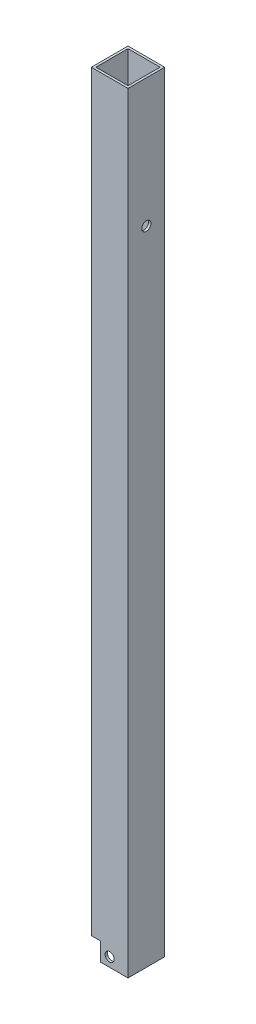
ISO-10303-21;
HEADER;
FILE_DESCRIPTION(('STEP AP214'),'2;1');
FILE_NAME('part.step','',(''),(''),'','','');
FILE_SCHEMA(('AUTOMOTIVE_DESIGN { 1 0 10303 214 1 1 1 1 }'));
ENDSEC;
DATA;
#1=APPLICATION_CONTEXT('core data for automotive mechanical design processes');
#2=APPLICATION_PROTOCOL_DEFINITION('international standard','automotive_design',2000,#1);
#3=PRODUCT_CONTEXT('',#1,'mechanical');
#4=PRODUCT('Part','Part','',(#3));
#5=PRODUCT_RELATED_PRODUCT_CATEGORY('part','',(#4));
#6=PRODUCT_DEFINITION_FORMATION('','',#4);
#7=PRODUCT_DEFINITION_CONTEXT('part definition',#1,'design');
#8=PRODUCT_DEFINITION('design','',#6,#7);
#9=PRODUCT_DEFINITION_SHAPE('','',#8);
#10=(LENGTH_UNIT() NAMED_UNIT(*) SI_UNIT(.MILLI.,.METRE.));
#11=(NAMED_UNIT(*) PLANE_ANGLE_UNIT() SI_UNIT($,.RADIAN.));
#12=(NAMED_UNIT(*) SI_UNIT($,.STERADIAN.) SOLID_ANGLE_UNIT());
#13=UNCERTAINTY_MEASURE_WITH_UNIT(LENGTH_MEASURE(1.E-05),#10,'distance_accuracy_value','');
#14=(GEOMETRIC_REPRESENTATION_CONTEXT(3) GLOBAL_UNCERTAINTY_ASSIGNED_CONTEXT((#13)) GLOBAL_UNIT_ASSIGNED_CONTEXT((#10,
#11,#12)) REPRESENTATION_CONTEXT('',''));
#15=CARTESIAN_POINT('',(0.,0.,0.));
#16=DIRECTION('',(0.,0.,1.));
#17=DIRECTION('',(1.,0.,0.));
#18=AXIS2_PLACEMENT_3D('',#15,#16,#17);
#19=CARTESIAN_POINT('',(0.,533.4,0.));
#20=DIRECTION('',(0.,-1.,0.));
#21=DIRECTION('',(0.,0.,-1.));
#22=AXIS2_PLACEMENT_3D('',#19,#20,#21);
#23=PLANE('',#22);
#24=DIRECTION('',(0.,0.,-1.));
#25=VECTOR('',#24,1.);
#26=CARTESIAN_POINT('',(12.7,533.4,12.7));
#27=LINE('',#26,#25);
#28=CARTESIAN_POINT('',(12.7,533.4,12.7));
#29=VERTEX_POINT('',#28);
#30=CARTESIAN_POINT('',(12.7,533.4,-12.7));
#31=VERTEX_POINT('',#30);
#32=EDGE_CURVE('E191',#29,#31,#27,.T.);
#33=ORIENTED_EDGE('',*,*,#32,.T.);
#34=DIRECTION('',(-1.,0.,0.));
#35=VECTOR('',#34,1.);
#36=CARTESIAN_POINT('',(-12.7,533.4,-12.7));
#37=LINE('',#36,#35);
#38=CARTESIAN_POINT('',(-12.7,533.4,-12.7));
#39=VERTEX_POINT('',#38);
#40=EDGE_CURVE('E194',#31,#39,#37,.T.);
#41=ORIENTED_EDGE('',*,*,#40,.T.);
#42=DIRECTION('',(0.,0.,1.));
#43=VECTOR('',#42,1.);
#44=CARTESIAN_POINT('',(-12.7,533.4,12.7));
#45=LINE('',#44,#43);
#46=CARTESIAN_POINT('',(-12.7,533.4,12.7));
#47=VERTEX_POINT('',#46);
#48=EDGE_CURVE('E197',#39,#47,#45,.T.);
#49=ORIENTED_EDGE('',*,*,#48,.T.);
#50=DIRECTION('',(1.,0.,0.));
#51=VECTOR('',#50,1.);
#52=CARTESIAN_POINT('',(-12.7,533.4,12.7));
#53=LINE('',#52,#51);
#54=EDGE_CURVE('E199',#47,#29,#53,.T.);
#55=ORIENTED_EDGE('',*,*,#54,.T.);
#56=EDGE_LOOP('',(#33,#41,#49,#55));
#57=FACE_BOUND('',#56,.T.);
#58=DIRECTION('',(0.,0.,-1.));
#59=VECTOR('',#58,1.);
#60=CARTESIAN_POINT('',(11.1125,533.4,11.1125));
#61=LINE('',#60,#59);
#62=CARTESIAN_POINT('',(11.1125,533.4,11.1125));
#63=VERTEX_POINT('',#62);
#64=CARTESIAN_POINT('',(11.1125,533.4,-11.1125));
#65=VERTEX_POINT('',#64);
#66=EDGE_CURVE('E165',#63,#65,#61,.T.);
#67=ORIENTED_EDGE('',*,*,#66,.F.);
#68=DIRECTION('',(1.,0.,0.));
#69=VECTOR('',#68,1.);
#70=CARTESIAN_POINT('',(-11.1125,533.4,11.1125));
#71=LINE('',#70,#69);
#72=CARTESIAN_POINT('',(-11.1125,533.4,11.1125));
#73=VERTEX_POINT('',#72);
#74=EDGE_CURVE('E172',#73,#63,#71,.T.);
#75=ORIENTED_EDGE('',*,*,#74,.F.);
#76=DIRECTION('',(0.,0.,1.));
#77=VECTOR('',#76,1.);
#78=CARTESIAN_POINT('',(-11.1125,533.4,11.1125));
#79=LINE('',#78,#77);
#80=CARTESIAN_POINT('',(-11.1125,533.4,-11.1125));
#81=VERTEX_POINT('',#80);
#82=EDGE_CURVE('E170',#81,#73,#79,.T.);
#83=ORIENTED_EDGE('',*,*,#82,.F.);
#84=DIRECTION('',(-1.,0.,0.));
#85=VECTOR('',#84,1.);
#86=CARTESIAN_POINT('',(-11.1125,533.4,-11.1125));
#87=LINE('',#86,#85);
#88=EDGE_CURVE('E167',#65,#81,#87,.T.);
#89=ORIENTED_EDGE('',*,*,#88,.F.);
#90=EDGE_LOOP('',(#67,#75,#83,#89));
#91=FACE_BOUND('',#90,.T.);
#92=ADVANCED_FACE('F33',(#57,#91),#23,.F.);
#93=CARTESIAN_POINT('',(0.,0.,0.));
#94=DIRECTION('',(0.,-1.,0.));
#95=DIRECTION('',(0.,0.,-1.));
#96=AXIS2_PLACEMENT_3D('',#93,#94,#95);
#97=PLANE('',#96);
#98=DIRECTION('',(0.,0.,1.));
#99=VECTOR('',#98,1.);
#100=CARTESIAN_POINT('',(-6.35,0.,-12.7));
#101=LINE('',#100,#99);
#102=CARTESIAN_POINT('',(-6.35,0.,-12.7));
#103=VERTEX_POINT('',#102);
#104=CARTESIAN_POINT('',(-6.35,0.,-11.1125));
#105=VERTEX_POINT('',#104);
#106=EDGE_CURVE('E156',#103,#105,#101,.T.);
#107=ORIENTED_EDGE('',*,*,#106,.F.);
#108=DIRECTION('',(-1.,0.,0.));
#109=VECTOR('',#108,1.);
#110=CARTESIAN_POINT('',(-12.7,0.,-12.7));
#111=LINE('',#110,#109);
#112=CARTESIAN_POINT('',(12.7,0.,-12.7));
#113=VERTEX_POINT('',#112);
#114=EDGE_CURVE('E145',#113,#103,#111,.T.);
#115=ORIENTED_EDGE('',*,*,#114,.F.);
#116=DIRECTION('',(0.,0.,-1.));
#117=VECTOR('',#116,1.);
#118=CARTESIAN_POINT('',(12.7,0.,12.7));
#119=LINE('',#118,#117);
#120=CARTESIAN_POINT('',(12.7,0.,12.7));
#121=VERTEX_POINT('',#120);
#122=EDGE_CURVE('E190',#121,#113,#119,.T.);
#123=ORIENTED_EDGE('',*,*,#122,.F.);
#124=DIRECTION('',(1.,0.,0.));
#125=VECTOR('',#124,1.);
#126=CARTESIAN_POINT('',(-12.7,0.,12.7));
#127=LINE('',#126,#125);
#128=CARTESIAN_POINT('',(-6.35,0.,12.7));
#129=VERTEX_POINT('',#128);
#130=EDGE_CURVE('E195',#129,#121,#127,.T.);
#131=ORIENTED_EDGE('',*,*,#130,.F.);
#132=CARTESIAN_POINT('',(-6.35,0.,11.1125));
#133=VERTEX_POINT('',#132);
#134=EDGE_CURVE('E158',#133,#129,#101,.T.);
#135=ORIENTED_EDGE('',*,*,#134,.F.);
#136=DIRECTION('',(1.,0.,0.));
#137=VECTOR('',#136,1.);
#138=CARTESIAN_POINT('',(-11.1125,0.,11.1125));
#139=LINE('',#138,#137);
#140=CARTESIAN_POINT('',(11.1125,0.,11.1125));
#141=VERTEX_POINT('',#140);
#142=EDGE_CURVE('E168',#133,#141,#139,.T.);
#143=ORIENTED_EDGE('',*,*,#142,.T.);
#144=DIRECTION('',(0.,0.,-1.));
#145=VECTOR('',#144,1.);
#146=CARTESIAN_POINT('',(11.1125,0.,11.1125));
#147=LINE('',#146,#145);
#148=CARTESIAN_POINT('',(11.1125,0.,-11.1125));
#149=VERTEX_POINT('',#148);
#150=EDGE_CURVE('E164',#141,#149,#147,.T.);
#151=ORIENTED_EDGE('',*,*,#150,.T.);
#152=DIRECTION('',(-1.,0.,0.));
#153=VECTOR('',#152,1.);
#154=CARTESIAN_POINT('',(-11.1125,0.,-11.1125));
#155=LINE('',#154,#153);
#156=EDGE_CURVE('E177',#149,#105,#155,.T.);
#157=ORIENTED_EDGE('',*,*,#156,.T.);
#158=EDGE_LOOP('',(#107,#115,#123,#131,#135,#143,#151,#157));
#159=FACE_BOUND('',#158,.T.);
#160=ADVANCED_FACE('F265',(#159),#97,.T.);
#161=CARTESIAN_POINT('',(12.7,533.4,12.7));
#162=DIRECTION('',(-1.,0.,0.));
#163=DIRECTION('',(0.,0.,1.));
#164=AXIS2_PLACEMENT_3D('',#161,#162,#163);
#165=PLANE('',#164);
#166=CARTESIAN_POINT('',(12.7,444.5,0.));
#167=DIRECTION('',(1.,0.,0.));
#168=DIRECTION('',(0.,0.,-1.));
#169=AXIS2_PLACEMENT_3D('',#166,#167,#168);
#170=CIRCLE('',#169,3.17499999999999);
#171=CARTESIAN_POINT('',(12.7,444.5,-3.17499999999999));
#172=VERTEX_POINT('',#171);
#173=EDGE_CURVE('E231',#172,#172,#170,.T.);
#174=ORIENTED_EDGE('',*,*,#173,.F.);
#175=EDGE_LOOP('',(#174));
#176=FACE_BOUND('',#175,.T.);
#177=ORIENTED_EDGE('',*,*,#122,.T.);
#178=DIRECTION('',(0.,-1.,0.));
#179=VECTOR('',#178,1.);
#180=CARTESIAN_POINT('',(12.7,533.4,-12.7));
#181=LINE('',#180,#179);
#182=EDGE_CURVE('E213',#31,#113,#181,.T.);
#183=ORIENTED_EDGE('',*,*,#182,.F.);
#184=ORIENTED_EDGE('',*,*,#32,.F.);
#185=DIRECTION('',(0.,-1.,0.));
#186=VECTOR('',#185,1.);
#187=CARTESIAN_POINT('',(12.7,533.4,12.7));
#188=LINE('',#187,#186);
#189=EDGE_CURVE('E201',#29,#121,#188,.T.);
#190=ORIENTED_EDGE('',*,*,#189,.T.);
#191=EDGE_LOOP('',(#177,#183,#184,#190));
#192=FACE_BOUND('',#191,.T.);
#193=ADVANCED_FACE('F35',(#176,#192),#165,.F.);
#194=CARTESIAN_POINT('',(-12.7,533.4,-12.7));
#195=DIRECTION('',(0.,0.,1.));
#196=DIRECTION('',(1.,0.,0.));
#197=AXIS2_PLACEMENT_3D('',#194,#195,#196);
#198=PLANE('',#197);
#199=CARTESIAN_POINT('',(0.,6.34999999999999,-12.7));
#200=DIRECTION('',(0.,0.,1.));
#201=DIRECTION('',(1.,0.,0.));
#202=AXIS2_PLACEMENT_3D('',#199,#200,#201);
#203=CIRCLE('',#202,3.175);
#204=CARTESIAN_POINT('',(3.175,6.34999999999999,-12.7));
#205=VERTEX_POINT('',#204);
#206=EDGE_CURVE('E217',#205,#205,#203,.T.);
#207=ORIENTED_EDGE('',*,*,#206,.T.);
#208=EDGE_LOOP('',(#207));
#209=FACE_BOUND('',#208,.T.);
#210=ORIENTED_EDGE('',*,*,#114,.T.);
#211=DIRECTION('',(0.,1.,0.));
#212=VECTOR('',#211,1.);
#213=CARTESIAN_POINT('',(-6.35,0.,-12.7));
#214=LINE('',#213,#212);
#215=CARTESIAN_POINT('',(-6.35,12.7,-12.7));
#216=VERTEX_POINT('',#215);
#217=EDGE_CURVE('E126',#103,#216,#214,.T.);
#218=ORIENTED_EDGE('',*,*,#217,.T.);
#219=DIRECTION('',(-1.,0.,0.));
#220=VECTOR('',#219,1.);
#221=CARTESIAN_POINT('',(-6.35,12.7,-12.7));
#222=LINE('',#221,#220);
#223=CARTESIAN_POINT('',(-12.7,12.7,-12.7));
#224=VERTEX_POINT('',#223);
#225=EDGE_CURVE('E135',#216,#224,#222,.T.);
#226=ORIENTED_EDGE('',*,*,#225,.T.);
#227=DIRECTION('',(0.,-1.,0.));
#228=VECTOR('',#227,1.);
#229=CARTESIAN_POINT('',(-12.7,533.4,-12.7));
#230=LINE('',#229,#228);
#231=EDGE_CURVE('E211',#39,#224,#230,.T.);
#232=ORIENTED_EDGE('',*,*,#231,.F.);
#233=ORIENTED_EDGE('',*,*,#40,.F.);
#234=ORIENTED_EDGE('',*,*,#182,.T.);
#235=EDGE_LOOP('',(#210,#218,#226,#232,#233,#234));
#236=FACE_BOUND('',#235,.T.);
#237=ADVANCED_FACE('F143',(#209,#236),#198,.F.);
#238=CARTESIAN_POINT('',(-12.7,533.4,12.7));
#239=DIRECTION('',(1.,0.,0.));
#240=DIRECTION('',(0.,0.,-1.));
#241=AXIS2_PLACEMENT_3D('',#238,#239,#240);
#242=PLANE('',#241);
#243=CARTESIAN_POINT('',(-12.7,444.5,0.));
#244=DIRECTION('',(1.,0.,0.));
#245=DIRECTION('',(0.,0.,-1.));
#246=AXIS2_PLACEMENT_3D('',#243,#244,#245);
#247=CIRCLE('',#246,3.17499999999999);
#248=CARTESIAN_POINT('',(-12.7,444.5,-3.17499999999999));
#249=VERTEX_POINT('',#248);
#250=EDGE_CURVE('E234',#249,#249,#247,.T.);
#251=ORIENTED_EDGE('',*,*,#250,.T.);
#252=EDGE_LOOP('',(#251));
#253=FACE_BOUND('',#252,.T.);
#254=ORIENTED_EDGE('',*,*,#231,.T.);
#255=DIRECTION('',(0.,0.,1.));
#256=VECTOR('',#255,1.);
#257=CARTESIAN_POINT('',(-12.7,12.7,-12.7));
#258=LINE('',#257,#256);
#259=CARTESIAN_POINT('',(-12.7,12.7,12.7));
#260=VERTEX_POINT('',#259);
#261=EDGE_CURVE('E131',#224,#260,#258,.T.);
#262=ORIENTED_EDGE('',*,*,#261,.T.);
#263=DIRECTION('',(0.,-1.,0.));
#264=VECTOR('',#263,1.);
#265=CARTESIAN_POINT('',(-12.7,533.4,12.7));
#266=LINE('',#265,#264);
#267=EDGE_CURVE('E208',#47,#260,#266,.T.);
#268=ORIENTED_EDGE('',*,*,#267,.F.);
#269=ORIENTED_EDGE('',*,*,#48,.F.);
#270=EDGE_LOOP('',(#254,#262,#268,#269));
#271=FACE_BOUND('',#270,.T.);
#272=ADVANCED_FACE('F276',(#253,#271),#242,.F.);
#273=CARTESIAN_POINT('',(-12.7,533.4,12.7));
#274=DIRECTION('',(0.,0.,-1.));
#275=DIRECTION('',(-1.,0.,0.));
#276=AXIS2_PLACEMENT_3D('',#273,#274,#275);
#277=PLANE('',#276);
#278=CARTESIAN_POINT('',(0.,6.34999999999999,12.7));
#279=DIRECTION('',(0.,0.,1.));
#280=DIRECTION('',(1.,0.,0.));
#281=AXIS2_PLACEMENT_3D('',#278,#279,#280);
#282=CIRCLE('',#281,3.175);
#283=CARTESIAN_POINT('',(3.175,6.34999999999999,12.7));
#284=VERTEX_POINT('',#283);
#285=EDGE_CURVE('E222',#284,#284,#282,.T.);
#286=ORIENTED_EDGE('',*,*,#285,.F.);
#287=EDGE_LOOP('',(#286));
#288=FACE_BOUND('',#287,.T.);
#289=DIRECTION('',(-1.,0.,0.));
#290=VECTOR('',#289,1.);
#291=CARTESIAN_POINT('',(-6.35,12.7,12.7));
#292=LINE('',#291,#290);
#293=CARTESIAN_POINT('',(-6.35,12.7,12.7));
#294=VERTEX_POINT('',#293);
#295=EDGE_CURVE('E146',#294,#260,#292,.T.);
#296=ORIENTED_EDGE('',*,*,#295,.F.);
#297=DIRECTION('',(0.,1.,0.));
#298=VECTOR('',#297,1.);
#299=CARTESIAN_POINT('',(-6.35,0.,12.7));
#300=LINE('',#299,#298);
#301=EDGE_CURVE('E148',#129,#294,#300,.T.);
#302=ORIENTED_EDGE('',*,*,#301,.F.);
#303=ORIENTED_EDGE('',*,*,#130,.T.);
#304=ORIENTED_EDGE('',*,*,#189,.F.);
#305=ORIENTED_EDGE('',*,*,#54,.F.);
#306=ORIENTED_EDGE('',*,*,#267,.T.);
#307=EDGE_LOOP('',(#296,#302,#303,#304,#305,#306));
#308=FACE_BOUND('',#307,.T.);
#309=ADVANCED_FACE('F279',(#288,#308),#277,.F.);
#310=CARTESIAN_POINT('',(11.1125,533.4,11.1125));
#311=DIRECTION('',(-1.,0.,0.));
#312=DIRECTION('',(0.,0.,1.));
#313=AXIS2_PLACEMENT_3D('',#310,#311,#312);
#314=PLANE('',#313);
#315=CARTESIAN_POINT('',(11.1125,444.5,0.));
#316=DIRECTION('',(-1.,0.,0.));
#317=DIRECTION('',(0.,0.,1.));
#318=AXIS2_PLACEMENT_3D('',#315,#316,#317);
#319=CIRCLE('',#318,3.17499999999999);
#320=CARTESIAN_POINT('',(11.1125,444.5,3.17499999999999));
#321=VERTEX_POINT('',#320);
#322=EDGE_CURVE('E227',#321,#321,#319,.T.);
#323=ORIENTED_EDGE('',*,*,#322,.F.);
#324=EDGE_LOOP('',(#323));
#325=FACE_BOUND('',#324,.T.);
#326=ORIENTED_EDGE('',*,*,#150,.F.);
#327=DIRECTION('',(0.,-1.,0.));
#328=VECTOR('',#327,1.);
#329=CARTESIAN_POINT('',(11.1125,533.4,11.1125));
#330=LINE('',#329,#328);
#331=EDGE_CURVE('E174',#63,#141,#330,.T.);
#332=ORIENTED_EDGE('',*,*,#331,.F.);
#333=ORIENTED_EDGE('',*,*,#66,.T.);
#334=DIRECTION('',(0.,-1.,0.));
#335=VECTOR('',#334,1.);
#336=CARTESIAN_POINT('',(11.1125,533.4,-11.1125));
#337=LINE('',#336,#335);
#338=EDGE_CURVE('E187',#65,#149,#337,.T.);
#339=ORIENTED_EDGE('',*,*,#338,.T.);
#340=EDGE_LOOP('',(#326,#332,#333,#339));
#341=FACE_BOUND('',#340,.T.);
#342=ADVANCED_FACE('F263',(#325,#341),#314,.T.);
#343=CARTESIAN_POINT('',(-11.1125,533.4,-11.1125));
#344=DIRECTION('',(0.,0.,1.));
#345=DIRECTION('',(1.,0.,0.));
#346=AXIS2_PLACEMENT_3D('',#343,#344,#345);
#347=PLANE('',#346);
#348=CARTESIAN_POINT('',(0.,6.34999999999999,-11.1125));
#349=DIRECTION('',(0.,0.,1.));
#350=DIRECTION('',(1.,0.,0.));
#351=AXIS2_PLACEMENT_3D('',#348,#349,#350);
#352=CIRCLE('',#351,3.175);
#353=CARTESIAN_POINT('',(3.175,6.34999999999999,-11.1125));
#354=VERTEX_POINT('',#353);
#355=EDGE_CURVE('E151',#354,#354,#352,.T.);
#356=ORIENTED_EDGE('',*,*,#355,.F.);
#357=EDGE_LOOP('',(#356));
#358=FACE_BOUND('',#357,.T.);
#359=DIRECTION('',(0.,1.,0.));
#360=VECTOR('',#359,1.);
#361=CARTESIAN_POINT('',(-6.35,533.4,-11.1125));
#362=LINE('',#361,#360);
#363=CARTESIAN_POINT('',(-6.35,12.7,-11.1125));
#364=VERTEX_POINT('',#363);
#365=EDGE_CURVE('E129',#105,#364,#362,.T.);
#366=ORIENTED_EDGE('',*,*,#365,.F.);
#367=ORIENTED_EDGE('',*,*,#156,.F.);
#368=ORIENTED_EDGE('',*,*,#338,.F.);
#369=ORIENTED_EDGE('',*,*,#88,.T.);
#370=DIRECTION('',(0.,-1.,0.));
#371=VECTOR('',#370,1.);
#372=CARTESIAN_POINT('',(-11.1125,533.4,-11.1125));
#373=LINE('',#372,#371);
#374=CARTESIAN_POINT('',(-11.1125,12.7,-11.1125));
#375=VERTEX_POINT('',#374);
#376=EDGE_CURVE('E184',#81,#375,#373,.T.);
#377=ORIENTED_EDGE('',*,*,#376,.T.);
#378=DIRECTION('',(-1.,0.,0.));
#379=VECTOR('',#378,1.);
#380=CARTESIAN_POINT('',(-11.1124999999992,12.7,-11.1125));
#381=LINE('',#380,#379);
#382=EDGE_CURVE('E161',#364,#375,#381,.T.);
#383=ORIENTED_EDGE('',*,*,#382,.F.);
#384=EDGE_LOOP('',(#366,#367,#368,#369,#377,#383));
#385=FACE_BOUND('',#384,.T.);
#386=ADVANCED_FACE('F248',(#358,#385),#347,.T.);
#387=CARTESIAN_POINT('',(-11.1125,533.4,11.1125));
#388=DIRECTION('',(1.,0.,0.));
#389=DIRECTION('',(0.,0.,-1.));
#390=AXIS2_PLACEMENT_3D('',#387,#388,#389);
#391=PLANE('',#390);
#392=CARTESIAN_POINT('',(-11.1125,444.5,0.));
#393=DIRECTION('',(1.,0.,0.));
#394=DIRECTION('',(0.,0.,-1.));
#395=AXIS2_PLACEMENT_3D('',#392,#393,#394);
#396=CIRCLE('',#395,3.17499999999999);
#397=CARTESIAN_POINT('',(-11.1125,444.5,-3.17499999999999));
#398=VERTEX_POINT('',#397);
#399=EDGE_CURVE('E37',#398,#398,#396,.T.);
#400=ORIENTED_EDGE('',*,*,#399,.F.);
#401=EDGE_LOOP('',(#400));
#402=FACE_BOUND('',#401,.T.);
#403=DIRECTION('',(0.,0.,1.));
#404=VECTOR('',#403,1.);
#405=CARTESIAN_POINT('',(-11.1125,12.7,11.1125));
#406=LINE('',#405,#404);
#407=CARTESIAN_POINT('',(-11.1125,12.7,11.1125));
#408=VERTEX_POINT('',#407);
#409=EDGE_CURVE('E50',#375,#408,#406,.T.);
#410=ORIENTED_EDGE('',*,*,#409,.F.);
#411=ORIENTED_EDGE('',*,*,#376,.F.);
#412=ORIENTED_EDGE('',*,*,#82,.T.);
#413=DIRECTION('',(0.,-1.,0.));
#414=VECTOR('',#413,1.);
#415=CARTESIAN_POINT('',(-11.1125,533.4,11.1125));
#416=LINE('',#415,#414);
#417=EDGE_CURVE('E57',#73,#408,#416,.T.);
#418=ORIENTED_EDGE('',*,*,#417,.T.);
#419=EDGE_LOOP('',(#410,#411,#412,#418));
#420=FACE_BOUND('',#419,.T.);
#421=ADVANCED_FACE('F244',(#402,#420),#391,.T.);
#422=CARTESIAN_POINT('',(-11.1125,533.4,11.1125));
#423=DIRECTION('',(0.,0.,-1.));
#424=DIRECTION('',(-1.,0.,0.));
#425=AXIS2_PLACEMENT_3D('',#422,#423,#424);
#426=PLANE('',#425);
#427=CARTESIAN_POINT('',(0.,6.34999999999999,11.1125));
#428=DIRECTION('',(0.,0.,-1.));
#429=DIRECTION('',(-1.,0.,0.));
#430=AXIS2_PLACEMENT_3D('',#427,#428,#429);
#431=CIRCLE('',#430,3.175);
#432=CARTESIAN_POINT('',(-3.175,6.34999999999999,11.1125));
#433=VERTEX_POINT('',#432);
#434=EDGE_CURVE('E215',#433,#433,#431,.T.);
#435=ORIENTED_EDGE('',*,*,#434,.F.);
#436=EDGE_LOOP('',(#435));
#437=FACE_BOUND('',#436,.T.);
#438=DIRECTION('',(0.,-1.,0.));
#439=VECTOR('',#438,1.);
#440=CARTESIAN_POINT('',(-6.35,533.4,11.1125));
#441=LINE('',#440,#439);
#442=CARTESIAN_POINT('',(-6.35,12.7,11.1125));
#443=VERTEX_POINT('',#442);
#444=EDGE_CURVE('E11',#443,#133,#441,.T.);
#445=ORIENTED_EDGE('',*,*,#444,.F.);
#446=DIRECTION('',(1.,0.,0.));
#447=VECTOR('',#446,1.);
#448=CARTESIAN_POINT('',(-11.1124999999992,12.7,11.1125));
#449=LINE('',#448,#447);
#450=EDGE_CURVE('E42',#408,#443,#449,.T.);
#451=ORIENTED_EDGE('',*,*,#450,.F.);
#452=ORIENTED_EDGE('',*,*,#417,.F.);
#453=ORIENTED_EDGE('',*,*,#74,.T.);
#454=ORIENTED_EDGE('',*,*,#331,.T.);
#455=ORIENTED_EDGE('',*,*,#142,.F.);
#456=EDGE_LOOP('',(#445,#451,#452,#453,#454,#455));
#457=FACE_BOUND('',#456,.T.);
#458=ADVANCED_FACE('F247',(#437,#457),#426,.T.);
#459=CARTESIAN_POINT('',(-6.35,0.,-12.7));
#460=DIRECTION('',(1.,0.,0.));
#461=DIRECTION('',(0.,0.,-1.));
#462=AXIS2_PLACEMENT_3D('',#459,#460,#461);
#463=PLANE('',#462);
#464=ORIENTED_EDGE('',*,*,#365,.T.);
#465=DIRECTION('',(0.,0.,1.));
#466=VECTOR('',#465,1.);
#467=CARTESIAN_POINT('',(-6.35,12.7,-12.7));
#468=LINE('',#467,#466);
#469=EDGE_CURVE('E122',#216,#364,#468,.T.);
#470=ORIENTED_EDGE('',*,*,#469,.F.);
#471=ORIENTED_EDGE('',*,*,#217,.F.);
#472=ORIENTED_EDGE('',*,*,#106,.T.);
#473=EDGE_LOOP('',(#464,#470,#471,#472));
#474=FACE_BOUND('',#473,.T.);
#475=ADVANCED_FACE('F124',(#474),#463,.F.);
#476=ORIENTED_EDGE('',*,*,#444,.T.);
#477=ORIENTED_EDGE('',*,*,#134,.T.);
#478=ORIENTED_EDGE('',*,*,#301,.T.);
#479=EDGE_CURVE('E132',#443,#294,#468,.T.);
#480=ORIENTED_EDGE('',*,*,#479,.F.);
#481=EDGE_LOOP('',(#476,#477,#478,#480));
#482=FACE_BOUND('',#481,.T.);
#483=ADVANCED_FACE('F270',(#482),#463,.F.);
#484=CARTESIAN_POINT('',(-6.35,12.7,-12.7));
#485=DIRECTION('',(0.,1.,0.));
#486=DIRECTION('',(-1.,0.,0.));
#487=AXIS2_PLACEMENT_3D('',#484,#485,#486);
#488=PLANE('',#487);
#489=ORIENTED_EDGE('',*,*,#382,.T.);
#490=ORIENTED_EDGE('',*,*,#409,.T.);
#491=ORIENTED_EDGE('',*,*,#450,.T.);
#492=ORIENTED_EDGE('',*,*,#479,.T.);
#493=ORIENTED_EDGE('',*,*,#295,.T.);
#494=ORIENTED_EDGE('',*,*,#261,.F.);
#495=ORIENTED_EDGE('',*,*,#225,.F.);
#496=ORIENTED_EDGE('',*,*,#469,.T.);
#497=EDGE_LOOP('',(#489,#490,#491,#492,#493,#494,#495,#496));
#498=FACE_BOUND('',#497,.T.);
#499=ADVANCED_FACE('F136',(#498),#488,.F.);
#500=CARTESIAN_POINT('',(0.,6.34999999999999,-12.7));
#501=DIRECTION('',(0.,0.,1.));
#502=DIRECTION('',(1.,0.,0.));
#503=AXIS2_PLACEMENT_3D('',#500,#501,#502);
#504=CYLINDRICAL_SURFACE('',#503,3.175);
#505=ORIENTED_EDGE('',*,*,#434,.T.);
#506=EDGE_LOOP('',(#505));
#507=FACE_BOUND('',#506,.T.);
#508=ORIENTED_EDGE('',*,*,#285,.T.);
#509=EDGE_LOOP('',(#508));
#510=FACE_BOUND('',#509,.T.);
#511=ADVANCED_FACE('F356',(#507,#510),#504,.F.);
#512=ORIENTED_EDGE('',*,*,#355,.T.);
#513=EDGE_LOOP('',(#512));
#514=FACE_BOUND('',#513,.T.);
#515=ORIENTED_EDGE('',*,*,#206,.F.);
#516=EDGE_LOOP('',(#515));
#517=FACE_BOUND('',#516,.T.);
#518=ADVANCED_FACE('F362',(#514,#517),#504,.F.);
#519=CARTESIAN_POINT('',(-12.7,444.5,0.));
#520=DIRECTION('',(1.,0.,0.));
#521=DIRECTION('',(0.,0.,-1.));
#522=AXIS2_PLACEMENT_3D('',#519,#520,#521);
#523=CYLINDRICAL_SURFACE('',#522,3.17499999999999);
#524=ORIENTED_EDGE('',*,*,#399,.T.);
#525=EDGE_LOOP('',(#524));
#526=FACE_BOUND('',#525,.T.);
#527=ORIENTED_EDGE('',*,*,#250,.F.);
#528=EDGE_LOOP('',(#527));
#529=FACE_BOUND('',#528,.T.);
#530=ADVANCED_FACE('F241',(#526,#529),#523,.F.);
#531=ORIENTED_EDGE('',*,*,#322,.T.);
#532=EDGE_LOOP('',(#531));
#533=FACE_BOUND('',#532,.T.);
#534=ORIENTED_EDGE('',*,*,#173,.T.);
#535=EDGE_LOOP('',(#534));
#536=FACE_BOUND('',#535,.T.);
#537=ADVANCED_FACE('F374',(#533,#536),#523,.F.);
#538=CLOSED_SHELL('',(#92,#160,#193,#237,#272,#309,#342,#386,#421,#458,#475,#483,#499,#511,#518,
#530,#537));
#539=MANIFOLD_SOLID_BREP('B2',#538);
#540=ADVANCED_BREP_SHAPE_REPRESENTATION('',(#18,#539),#14);
#541=SHAPE_DEFINITION_REPRESENTATION(#9,#540);
ENDSEC;
END-ISO-10303-21;
